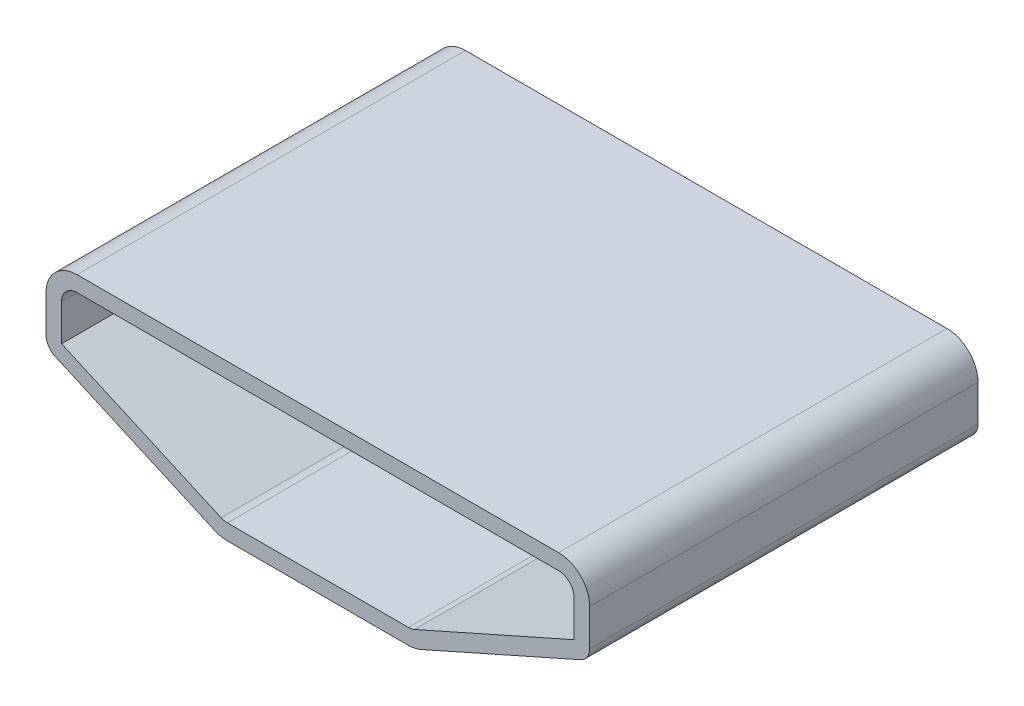
ISO-10303-21;
HEADER;
FILE_DESCRIPTION(('STEP AP214'),'2;1');
FILE_NAME('part.step','',(''),(''),'','','');
FILE_SCHEMA(('AUTOMOTIVE_DESIGN { 1 0 10303 214 1 1 1 1 }'));
ENDSEC;
DATA;
#1=APPLICATION_CONTEXT('core data for automotive mechanical design processes');
#2=APPLICATION_PROTOCOL_DEFINITION('international standard','automotive_design',2000,#1);
#3=PRODUCT_CONTEXT('',#1,'mechanical');
#4=PRODUCT('Part','Part','',(#3));
#5=PRODUCT_RELATED_PRODUCT_CATEGORY('part','',(#4));
#6=PRODUCT_DEFINITION_FORMATION('','',#4);
#7=PRODUCT_DEFINITION_CONTEXT('part definition',#1,'design');
#8=PRODUCT_DEFINITION('design','',#6,#7);
#9=PRODUCT_DEFINITION_SHAPE('','',#8);
#10=(LENGTH_UNIT() NAMED_UNIT(*) SI_UNIT(.MILLI.,.METRE.));
#11=(NAMED_UNIT(*) PLANE_ANGLE_UNIT() SI_UNIT($,.RADIAN.));
#12=(NAMED_UNIT(*) SI_UNIT($,.STERADIAN.) SOLID_ANGLE_UNIT());
#13=UNCERTAINTY_MEASURE_WITH_UNIT(LENGTH_MEASURE(1.E-05),#10,'distance_accuracy_value','');
#14=(GEOMETRIC_REPRESENTATION_CONTEXT(3) GLOBAL_UNCERTAINTY_ASSIGNED_CONTEXT((#13)) GLOBAL_UNIT_ASSIGNED_CONTEXT((#10,
#11,#12)) REPRESENTATION_CONTEXT('',''));
#15=CARTESIAN_POINT('',(0.,0.,0.));
#16=DIRECTION('',(0.,0.,1.));
#17=DIRECTION('',(1.,0.,0.));
#18=AXIS2_PLACEMENT_3D('',#15,#16,#17);
#19=CARTESIAN_POINT('',(1.07490488899147,0.0214013968547076,5.));
#20=DIRECTION('',(0.,0.,1.));
#21=DIRECTION('',(1.,0.,0.));
#22=AXIS2_PLACEMENT_3D('',#19,#20,#21);
#23=PLANE('',#22);
#24=CARTESIAN_POINT('',(1.07490488899147,0.0214013968547076,5.));
#25=DIRECTION('',(0.,0.,1.));
#26=DIRECTION('',(1.,0.,0.));
#27=AXIS2_PLACEMENT_3D('',#24,#25,#26);
#28=CIRCLE('',#27,0.4);
#29=CARTESIAN_POINT('',(1.47490488899147,0.0214013968547047,5.));
#30=VERTEX_POINT('',#29);
#31=CARTESIAN_POINT('',(1.07490488899146,0.421401396854708,5.));
#32=VERTEX_POINT('',#31);
#33=EDGE_CURVE('E273',#30,#32,#28,.T.);
#34=ORIENTED_EDGE('',*,*,#33,.T.);
#35=DIRECTION('',(-1.,0.,0.));
#36=VECTOR('',#35,1.);
#37=CARTESIAN_POINT('',(-5.12509511100853,0.421401396854708,5.));
#38=LINE('',#37,#36);
#39=CARTESIAN_POINT('',(-5.12509511100853,0.421401396854708,5.));
#40=VERTEX_POINT('',#39);
#41=EDGE_CURVE('E276',#32,#40,#38,.T.);
#42=ORIENTED_EDGE('',*,*,#41,.T.);
#43=CARTESIAN_POINT('',(-5.12509511100853,0.0214013968547076,5.));
#44=DIRECTION('',(0.,0.,1.));
#45=DIRECTION('',(-1.,0.,0.));
#46=AXIS2_PLACEMENT_3D('',#43,#44,#45);
#47=CIRCLE('',#46,0.4);
#48=CARTESIAN_POINT('',(-5.52509511100853,0.0214013968547047,5.));
#49=VERTEX_POINT('',#48);
#50=EDGE_CURVE('E279',#40,#49,#47,.T.);
#51=ORIENTED_EDGE('',*,*,#50,.T.);
#52=DIRECTION('',(0.,-1.,0.));
#53=VECTOR('',#52,1.);
#54=CARTESIAN_POINT('',(-5.52509511100853,-0.4486239853276,5.));
#55=LINE('',#54,#53);
#56=CARTESIAN_POINT('',(-5.52509511100853,-0.4486239853276,5.));
#57=VERTEX_POINT('',#56);
#58=EDGE_CURVE('E281',#49,#57,#55,.T.);
#59=ORIENTED_EDGE('',*,*,#58,.T.);
#60=CARTESIAN_POINT('',(-5.32509511100853,-0.448623985327601,5.));
#61=DIRECTION('',(0.,0.,1.));
#62=DIRECTION('',(1.,0.,0.));
#63=AXIS2_PLACEMENT_3D('',#60,#61,#62);
#64=CIRCLE('',#63,0.2);
#65=CARTESIAN_POINT('',(-5.40632280421922,-0.631386295051653,5.));
#66=VERTEX_POINT('',#65);
#67=EDGE_CURVE('E283',#57,#66,#64,.T.);
#68=ORIENTED_EDGE('',*,*,#67,.T.);
#69=DIRECTION('',(0.913811548620257,-0.406138466053448,0.));
#70=VECTOR('',#69,1.);
#71=CARTESIAN_POINT('',(-3.3526647172503,-1.54412322259339,5.));
#72=LINE('',#71,#70);
#73=CARTESIAN_POINT('',(-3.3526647172503,-1.54412322259339,5.));
#74=VERTEX_POINT('',#73);
#75=EDGE_CURVE('E285',#66,#74,#72,.T.);
#76=ORIENTED_EDGE('',*,*,#75,.T.);
#77=CARTESIAN_POINT('',(-3.19020933082892,-1.17859860314529,5.));
#78=DIRECTION('',(0.,0.,1.));
#79=DIRECTION('',(-1.,0.,0.));
#80=AXIS2_PLACEMENT_3D('',#77,#78,#79);
#81=CIRCLE('',#80,0.4);
#82=CARTESIAN_POINT('',(-3.19020933082892,-1.57859860314529,5.));
#83=VERTEX_POINT('',#82);
#84=EDGE_CURVE('E287',#74,#83,#81,.T.);
#85=ORIENTED_EDGE('',*,*,#84,.T.);
#86=DIRECTION('',(1.,0.,0.));
#87=VECTOR('',#86,1.);
#88=CARTESIAN_POINT('',(-3.19020933082892,-1.57859860314529,5.));
#89=LINE('',#88,#87);
#90=CARTESIAN_POINT('',(-0.859980891188146,-1.57859860314529,5.));
#91=VERTEX_POINT('',#90);
#92=EDGE_CURVE('E289',#83,#91,#89,.T.);
#93=ORIENTED_EDGE('',*,*,#92,.T.);
#94=CARTESIAN_POINT('',(-0.859980891188145,-1.17859860314529,5.));
#95=DIRECTION('',(0.,0.,1.));
#96=DIRECTION('',(1.,0.,0.));
#97=AXIS2_PLACEMENT_3D('',#94,#95,#96);
#98=CIRCLE('',#97,0.4);
#99=CARTESIAN_POINT('',(-0.697525504766764,-1.54412322259339,5.));
#100=VERTEX_POINT('',#99);
#101=EDGE_CURVE('E291',#91,#100,#98,.T.);
#102=ORIENTED_EDGE('',*,*,#101,.T.);
#103=DIRECTION('',(0.913811548620257,0.406138466053448,0.));
#104=VECTOR('',#103,1.);
#105=CARTESIAN_POINT('',(-0.697525504766764,-1.54412322259339,5.));
#106=LINE('',#105,#104);
#107=CARTESIAN_POINT('',(1.35613258220215,-0.631386295051653,5.));
#108=VERTEX_POINT('',#107);
#109=EDGE_CURVE('E293',#100,#108,#106,.T.);
#110=ORIENTED_EDGE('',*,*,#109,.T.);
#111=CARTESIAN_POINT('',(1.27490488899147,-0.448623985327601,5.));
#112=DIRECTION('',(0.,0.,1.));
#113=DIRECTION('',(-1.,0.,0.));
#114=AXIS2_PLACEMENT_3D('',#111,#112,#113);
#115=CIRCLE('',#114,0.2);
#116=CARTESIAN_POINT('',(1.47490488899147,-0.4486239853276,5.));
#117=VERTEX_POINT('',#116);
#118=EDGE_CURVE('E295',#108,#117,#115,.T.);
#119=ORIENTED_EDGE('',*,*,#118,.T.);
#120=DIRECTION('',(0.,1.,0.));
#121=VECTOR('',#120,1.);
#122=CARTESIAN_POINT('',(1.47490488899147,-0.4486239853276,5.));
#123=LINE('',#122,#121);
#124=EDGE_CURVE('E297',#117,#30,#123,.T.);
#125=ORIENTED_EDGE('',*,*,#124,.T.);
#126=EDGE_LOOP('',(#34,#42,#51,#59,#68,#76,#85,#93,#102,#110,#119,#125));
#127=FACE_BOUND('',#126,.T.);
#128=DIRECTION('',(0.913811548620257,0.406138466053448,0.));
#129=VECTOR('',#128,1.);
#130=CARTESIAN_POINT('',(-0.778753197977454,-1.36136091286934,5.));
#131=LINE('',#130,#129);
#132=CARTESIAN_POINT('',(-0.778753197977454,-1.36136091286934,5.));
#133=VERTEX_POINT('',#132);
#134=CARTESIAN_POINT('',(1.27490488899146,-0.448623985327601,5.));
#135=VERTEX_POINT('',#134);
#136=EDGE_CURVE('E233',#133,#135,#131,.T.);
#137=ORIENTED_EDGE('',*,*,#136,.F.);
#138=CARTESIAN_POINT('',(-0.859980891188145,-1.17859860314529,5.));
#139=DIRECTION('',(0.,0.,1.));
#140=DIRECTION('',(1.,0.,0.));
#141=AXIS2_PLACEMENT_3D('',#138,#139,#140);
#142=CIRCLE('',#141,0.2);
#143=CARTESIAN_POINT('',(-0.859980891188145,-1.37859860314529,5.));
#144=VERTEX_POINT('',#143);
#145=EDGE_CURVE('E231',#144,#133,#142,.T.);
#146=ORIENTED_EDGE('',*,*,#145,.F.);
#147=DIRECTION('',(1.,0.,0.));
#148=VECTOR('',#147,1.);
#149=CARTESIAN_POINT('',(-3.19020933082892,-1.37859860314529,5.));
#150=LINE('',#149,#148);
#151=CARTESIAN_POINT('',(-3.19020933082892,-1.37859860314529,5.));
#152=VERTEX_POINT('',#151);
#153=EDGE_CURVE('E197',#152,#144,#150,.T.);
#154=ORIENTED_EDGE('',*,*,#153,.F.);
#155=CARTESIAN_POINT('',(-3.19020933082892,-1.17859860314529,5.));
#156=DIRECTION('',(0.,0.,1.));
#157=DIRECTION('',(-1.,0.,0.));
#158=AXIS2_PLACEMENT_3D('',#155,#156,#157);
#159=CIRCLE('',#158,0.2);
#160=CARTESIAN_POINT('',(-3.27143702403961,-1.36136091286934,5.));
#161=VERTEX_POINT('',#160);
#162=EDGE_CURVE('E247',#161,#152,#159,.T.);
#163=ORIENTED_EDGE('',*,*,#162,.F.);
#164=DIRECTION('',(0.913811548620257,-0.406138466053448,0.));
#165=VECTOR('',#164,1.);
#166=CARTESIAN_POINT('',(-3.27143702403961,-1.36136091286934,5.));
#167=LINE('',#166,#165);
#168=CARTESIAN_POINT('',(-5.32509511100853,-0.4486239853276,5.));
#169=VERTEX_POINT('',#168);
#170=EDGE_CURVE('E245',#169,#161,#167,.T.);
#171=ORIENTED_EDGE('',*,*,#170,.F.);
#172=DIRECTION('',(0.,-1.,0.));
#173=VECTOR('',#172,1.);
#174=CARTESIAN_POINT('',(-5.32509511100853,-0.4486239853276,5.));
#175=LINE('',#174,#173);
#176=CARTESIAN_POINT('',(-5.32509511100853,0.0214013968547062,5.));
#177=VERTEX_POINT('',#176);
#178=EDGE_CURVE('E243',#177,#169,#175,.T.);
#179=ORIENTED_EDGE('',*,*,#178,.F.);
#180=CARTESIAN_POINT('',(-5.12509511100853,0.0214013968547076,5.));
#181=DIRECTION('',(0.,0.,1.));
#182=DIRECTION('',(-1.,0.,0.));
#183=AXIS2_PLACEMENT_3D('',#180,#181,#182);
#184=CIRCLE('',#183,0.2);
#185=CARTESIAN_POINT('',(-5.12509511100853,0.221401396854707,5.));
#186=VERTEX_POINT('',#185);
#187=EDGE_CURVE('E241',#186,#177,#184,.T.);
#188=ORIENTED_EDGE('',*,*,#187,.F.);
#189=DIRECTION('',(-1.,0.,0.));
#190=VECTOR('',#189,1.);
#191=CARTESIAN_POINT('',(-5.12509511100853,0.221401396854708,5.));
#192=LINE('',#191,#190);
#193=CARTESIAN_POINT('',(1.07490488899146,0.221401396854708,5.));
#194=VERTEX_POINT('',#193);
#195=EDGE_CURVE('E239',#194,#186,#192,.T.);
#196=ORIENTED_EDGE('',*,*,#195,.F.);
#197=CARTESIAN_POINT('',(1.07490488899147,0.0214013968547076,5.));
#198=DIRECTION('',(0.,0.,1.));
#199=DIRECTION('',(1.,0.,0.));
#200=AXIS2_PLACEMENT_3D('',#197,#198,#199);
#201=CIRCLE('',#200,0.2);
#202=CARTESIAN_POINT('',(1.27490488899147,0.0214013968547048,5.));
#203=VERTEX_POINT('',#202);
#204=EDGE_CURVE('E237',#203,#194,#201,.T.);
#205=ORIENTED_EDGE('',*,*,#204,.F.);
#206=DIRECTION('',(0.,1.,0.));
#207=VECTOR('',#206,1.);
#208=CARTESIAN_POINT('',(1.27490488899146,-0.448623985327601,5.));
#209=LINE('',#208,#207);
#210=EDGE_CURVE('E235',#135,#203,#209,.T.);
#211=ORIENTED_EDGE('',*,*,#210,.F.);
#212=EDGE_LOOP('',(#137,#146,#154,#163,#171,#179,#188,#196,#205,#211));
#213=FACE_BOUND('',#212,.T.);
#214=ADVANCED_FACE('F39',(#127,#213),#23,.T.);
#215=CARTESIAN_POINT('',(1.07490488899147,0.0214013968547076,0.));
#216=DIRECTION('',(0.,0.,1.));
#217=DIRECTION('',(1.,0.,0.));
#218=AXIS2_PLACEMENT_3D('',#215,#216,#217);
#219=PLANE('',#218);
#220=DIRECTION('',(0.,-1.,0.));
#221=VECTOR('',#220,1.);
#222=CARTESIAN_POINT('',(-5.52509511100853,-0.4486239853276,0.));
#223=LINE('',#222,#221);
#224=CARTESIAN_POINT('',(-5.52509511100853,0.0214013968547047,0.));
#225=VERTEX_POINT('',#224);
#226=CARTESIAN_POINT('',(-5.52509511100853,-0.4486239853276,0.));
#227=VERTEX_POINT('',#226);
#228=EDGE_CURVE('E306',#225,#227,#223,.T.);
#229=ORIENTED_EDGE('',*,*,#228,.F.);
#230=CARTESIAN_POINT('',(-5.12509511100853,0.0214013968547076,0.));
#231=DIRECTION('',(0.,0.,1.));
#232=DIRECTION('',(-1.,0.,0.));
#233=AXIS2_PLACEMENT_3D('',#230,#231,#232);
#234=CIRCLE('',#233,0.4);
#235=CARTESIAN_POINT('',(-5.12509511100853,0.421401396854708,0.));
#236=VERTEX_POINT('',#235);
#237=EDGE_CURVE('E304',#236,#225,#234,.T.);
#238=ORIENTED_EDGE('',*,*,#237,.F.);
#239=DIRECTION('',(-1.,0.,0.));
#240=VECTOR('',#239,1.);
#241=CARTESIAN_POINT('',(-5.12509511100853,0.421401396854708,0.));
#242=LINE('',#241,#240);
#243=CARTESIAN_POINT('',(1.07490488899146,0.421401396854708,0.));
#244=VERTEX_POINT('',#243);
#245=EDGE_CURVE('E302',#244,#236,#242,.T.);
#246=ORIENTED_EDGE('',*,*,#245,.F.);
#247=CARTESIAN_POINT('',(1.07490488899147,0.0214013968547076,0.));
#248=DIRECTION('',(0.,0.,1.));
#249=DIRECTION('',(1.,0.,0.));
#250=AXIS2_PLACEMENT_3D('',#247,#248,#249);
#251=CIRCLE('',#250,0.4);
#252=CARTESIAN_POINT('',(1.47490488899147,0.0214013968547047,0.));
#253=VERTEX_POINT('',#252);
#254=EDGE_CURVE('E272',#253,#244,#251,.T.);
#255=ORIENTED_EDGE('',*,*,#254,.F.);
#256=DIRECTION('',(0.,1.,0.));
#257=VECTOR('',#256,1.);
#258=CARTESIAN_POINT('',(1.47490488899147,-0.4486239853276,0.));
#259=LINE('',#258,#257);
#260=CARTESIAN_POINT('',(1.47490488899147,-0.4486239853276,0.));
#261=VERTEX_POINT('',#260);
#262=EDGE_CURVE('E277',#261,#253,#259,.T.);
#263=ORIENTED_EDGE('',*,*,#262,.F.);
#264=CARTESIAN_POINT('',(1.27490488899147,-0.448623985327601,0.));
#265=DIRECTION('',(0.,0.,1.));
#266=DIRECTION('',(-1.,0.,0.));
#267=AXIS2_PLACEMENT_3D('',#264,#265,#266);
#268=CIRCLE('',#267,0.2);
#269=CARTESIAN_POINT('',(1.35613258220215,-0.631386295051653,0.));
#270=VERTEX_POINT('',#269);
#271=EDGE_CURVE('E320',#270,#261,#268,.T.);
#272=ORIENTED_EDGE('',*,*,#271,.F.);
#273=DIRECTION('',(0.913811548620257,0.406138466053448,0.));
#274=VECTOR('',#273,1.);
#275=CARTESIAN_POINT('',(-0.697525504766764,-1.54412322259339,0.));
#276=LINE('',#275,#274);
#277=CARTESIAN_POINT('',(-0.697525504766764,-1.54412322259339,0.));
#278=VERTEX_POINT('',#277);
#279=EDGE_CURVE('E318',#278,#270,#276,.T.);
#280=ORIENTED_EDGE('',*,*,#279,.F.);
#281=CARTESIAN_POINT('',(-0.859980891188145,-1.17859860314529,0.));
#282=DIRECTION('',(0.,0.,1.));
#283=DIRECTION('',(1.,0.,0.));
#284=AXIS2_PLACEMENT_3D('',#281,#282,#283);
#285=CIRCLE('',#284,0.4);
#286=CARTESIAN_POINT('',(-0.859980891188146,-1.57859860314529,0.));
#287=VERTEX_POINT('',#286);
#288=EDGE_CURVE('E316',#287,#278,#285,.T.);
#289=ORIENTED_EDGE('',*,*,#288,.F.);
#290=DIRECTION('',(1.,0.,0.));
#291=VECTOR('',#290,1.);
#292=CARTESIAN_POINT('',(-3.19020933082892,-1.57859860314529,0.));
#293=LINE('',#292,#291);
#294=CARTESIAN_POINT('',(-3.19020933082892,-1.57859860314529,0.));
#295=VERTEX_POINT('',#294);
#296=EDGE_CURVE('E314',#295,#287,#293,.T.);
#297=ORIENTED_EDGE('',*,*,#296,.F.);
#298=CARTESIAN_POINT('',(-3.19020933082892,-1.17859860314529,0.));
#299=DIRECTION('',(0.,0.,1.));
#300=DIRECTION('',(-1.,0.,0.));
#301=AXIS2_PLACEMENT_3D('',#298,#299,#300);
#302=CIRCLE('',#301,0.4);
#303=CARTESIAN_POINT('',(-3.3526647172503,-1.54412322259339,0.));
#304=VERTEX_POINT('',#303);
#305=EDGE_CURVE('E312',#304,#295,#302,.T.);
#306=ORIENTED_EDGE('',*,*,#305,.F.);
#307=DIRECTION('',(0.913811548620257,-0.406138466053448,0.));
#308=VECTOR('',#307,1.);
#309=CARTESIAN_POINT('',(-3.3526647172503,-1.54412322259339,0.));
#310=LINE('',#309,#308);
#311=CARTESIAN_POINT('',(-5.40632280421922,-0.631386295051653,0.));
#312=VERTEX_POINT('',#311);
#313=EDGE_CURVE('E310',#312,#304,#310,.T.);
#314=ORIENTED_EDGE('',*,*,#313,.F.);
#315=CARTESIAN_POINT('',(-5.32509511100853,-0.448623985327601,0.));
#316=DIRECTION('',(0.,0.,1.));
#317=DIRECTION('',(1.,0.,0.));
#318=AXIS2_PLACEMENT_3D('',#315,#316,#317);
#319=CIRCLE('',#318,0.2);
#320=EDGE_CURVE('E308',#227,#312,#319,.T.);
#321=ORIENTED_EDGE('',*,*,#320,.F.);
#322=EDGE_LOOP('',(#229,#238,#246,#255,#263,#272,#280,#289,#297,#306,#314,#321));
#323=FACE_BOUND('',#322,.T.);
#324=ADVANCED_FACE('F361',(#323),#219,.F.);
#325=CARTESIAN_POINT('',(1.07490488899147,0.0214013968547076,5.));
#326=DIRECTION('',(0.,0.,-1.));
#327=DIRECTION('',(-1.,0.,0.));
#328=AXIS2_PLACEMENT_3D('',#325,#326,#327);
#329=CYLINDRICAL_SURFACE('',#328,0.4);
#330=ORIENTED_EDGE('',*,*,#254,.T.);
#331=DIRECTION('',(0.,0.,-1.));
#332=VECTOR('',#331,1.);
#333=CARTESIAN_POINT('',(1.07490488899146,0.421401396854708,5.));
#334=LINE('',#333,#332);
#335=EDGE_CURVE('E11',#32,#244,#334,.T.);
#336=ORIENTED_EDGE('',*,*,#335,.F.);
#337=ORIENTED_EDGE('',*,*,#33,.F.);
#338=DIRECTION('',(0.,0.,-1.));
#339=VECTOR('',#338,1.);
#340=CARTESIAN_POINT('',(1.47490488899147,0.0214013968547047,5.));
#341=LINE('',#340,#339);
#342=EDGE_CURVE('E299',#30,#253,#341,.T.);
#343=ORIENTED_EDGE('',*,*,#342,.T.);
#344=EDGE_LOOP('',(#330,#336,#337,#343));
#345=FACE_BOUND('',#344,.T.);
#346=ADVANCED_FACE('F41',(#345),#329,.T.);
#347=CARTESIAN_POINT('',(-5.12509511100853,0.421401396854708,5.));
#348=DIRECTION('',(0.,-1.,0.));
#349=DIRECTION('',(0.,0.,-1.));
#350=AXIS2_PLACEMENT_3D('',#347,#348,#349);
#351=PLANE('',#350);
#352=ORIENTED_EDGE('',*,*,#245,.T.);
#353=DIRECTION('',(0.,0.,-1.));
#354=VECTOR('',#353,1.);
#355=CARTESIAN_POINT('',(-5.12509511100853,0.421401396854708,5.));
#356=LINE('',#355,#354);
#357=EDGE_CURVE('E47',#40,#236,#356,.T.);
#358=ORIENTED_EDGE('',*,*,#357,.F.);
#359=ORIENTED_EDGE('',*,*,#41,.F.);
#360=ORIENTED_EDGE('',*,*,#335,.T.);
#361=EDGE_LOOP('',(#352,#358,#359,#360));
#362=FACE_BOUND('',#361,.T.);
#363=ADVANCED_FACE('F379',(#362),#351,.F.);
#364=CARTESIAN_POINT('',(-5.12509511100853,0.0214013968547076,5.));
#365=DIRECTION('',(0.,0.,-1.));
#366=DIRECTION('',(-1.,0.,0.));
#367=AXIS2_PLACEMENT_3D('',#364,#365,#366);
#368=CYLINDRICAL_SURFACE('',#367,0.4);
#369=ORIENTED_EDGE('',*,*,#237,.T.);
#370=DIRECTION('',(0.,0.,-1.));
#371=VECTOR('',#370,1.);
#372=CARTESIAN_POINT('',(-5.52509511100853,0.0214013968547047,5.));
#373=LINE('',#372,#371);
#374=EDGE_CURVE('E349',#49,#225,#373,.T.);
#375=ORIENTED_EDGE('',*,*,#374,.F.);
#376=ORIENTED_EDGE('',*,*,#50,.F.);
#377=ORIENTED_EDGE('',*,*,#357,.T.);
#378=EDGE_LOOP('',(#369,#375,#376,#377));
#379=FACE_BOUND('',#378,.T.);
#380=ADVANCED_FACE('F356',(#379),#368,.T.);
#381=CARTESIAN_POINT('',(-5.52509511100853,-0.4486239853276,5.));
#382=DIRECTION('',(1.,0.,0.));
#383=DIRECTION('',(0.,0.,-1.));
#384=AXIS2_PLACEMENT_3D('',#381,#382,#383);
#385=PLANE('',#384);
#386=ORIENTED_EDGE('',*,*,#228,.T.);
#387=DIRECTION('',(0.,0.,-1.));
#388=VECTOR('',#387,1.);
#389=CARTESIAN_POINT('',(-5.52509511100853,-0.4486239853276,5.));
#390=LINE('',#389,#388);
#391=EDGE_CURVE('E346',#57,#227,#390,.T.);
#392=ORIENTED_EDGE('',*,*,#391,.F.);
#393=ORIENTED_EDGE('',*,*,#58,.F.);
#394=ORIENTED_EDGE('',*,*,#374,.T.);
#395=EDGE_LOOP('',(#386,#392,#393,#394));
#396=FACE_BOUND('',#395,.T.);
#397=ADVANCED_FACE('F367',(#396),#385,.F.);
#398=CARTESIAN_POINT('',(-5.32509511100853,-0.448623985327601,5.));
#399=DIRECTION('',(0.,0.,-1.));
#400=DIRECTION('',(-1.,0.,0.));
#401=AXIS2_PLACEMENT_3D('',#398,#399,#400);
#402=CYLINDRICAL_SURFACE('',#401,0.2);
#403=ORIENTED_EDGE('',*,*,#320,.T.);
#404=DIRECTION('',(0.,0.,-1.));
#405=VECTOR('',#404,1.);
#406=CARTESIAN_POINT('',(-5.40632280421922,-0.631386295051653,5.));
#407=LINE('',#406,#405);
#408=EDGE_CURVE('E343',#66,#312,#407,.T.);
#409=ORIENTED_EDGE('',*,*,#408,.F.);
#410=ORIENTED_EDGE('',*,*,#67,.F.);
#411=ORIENTED_EDGE('',*,*,#391,.T.);
#412=EDGE_LOOP('',(#403,#409,#410,#411));
#413=FACE_BOUND('',#412,.T.);
#414=ADVANCED_FACE('F371',(#413),#402,.T.);
#415=CARTESIAN_POINT('',(-3.3526647172503,-1.54412322259339,5.));
#416=DIRECTION('',(0.406138466053448,0.913811548620257,0.));
#417=DIRECTION('',(-0.913811548620257,0.406138466053448,0.));
#418=AXIS2_PLACEMENT_3D('',#415,#416,#417);
#419=PLANE('',#418);
#420=ORIENTED_EDGE('',*,*,#313,.T.);
#421=DIRECTION('',(0.,0.,-1.));
#422=VECTOR('',#421,1.);
#423=CARTESIAN_POINT('',(-3.3526647172503,-1.54412322259339,5.));
#424=LINE('',#423,#422);
#425=EDGE_CURVE('E340',#74,#304,#424,.T.);
#426=ORIENTED_EDGE('',*,*,#425,.F.);
#427=ORIENTED_EDGE('',*,*,#75,.F.);
#428=ORIENTED_EDGE('',*,*,#408,.T.);
#429=EDGE_LOOP('',(#420,#426,#427,#428));
#430=FACE_BOUND('',#429,.T.);
#431=ADVANCED_FACE('F412',(#430),#419,.F.);
#432=CARTESIAN_POINT('',(-3.19020933082892,-1.17859860314529,5.));
#433=DIRECTION('',(0.,0.,-1.));
#434=DIRECTION('',(-1.,0.,0.));
#435=AXIS2_PLACEMENT_3D('',#432,#433,#434);
#436=CYLINDRICAL_SURFACE('',#435,0.4);
#437=ORIENTED_EDGE('',*,*,#305,.T.);
#438=DIRECTION('',(0.,0.,-1.));
#439=VECTOR('',#438,1.);
#440=CARTESIAN_POINT('',(-3.19020933082892,-1.57859860314529,5.));
#441=LINE('',#440,#439);
#442=EDGE_CURVE('E337',#83,#295,#441,.T.);
#443=ORIENTED_EDGE('',*,*,#442,.F.);
#444=ORIENTED_EDGE('',*,*,#84,.F.);
#445=ORIENTED_EDGE('',*,*,#425,.T.);
#446=EDGE_LOOP('',(#437,#443,#444,#445));
#447=FACE_BOUND('',#446,.T.);
#448=ADVANCED_FACE('F410',(#447),#436,.T.);
#449=CARTESIAN_POINT('',(-3.19020933082892,-1.57859860314529,5.));
#450=DIRECTION('',(0.,1.,0.));
#451=DIRECTION('',(0.,0.,1.));
#452=AXIS2_PLACEMENT_3D('',#449,#450,#451);
#453=PLANE('',#452);
#454=ORIENTED_EDGE('',*,*,#296,.T.);
#455=DIRECTION('',(0.,0.,-1.));
#456=VECTOR('',#455,1.);
#457=CARTESIAN_POINT('',(-0.859980891188146,-1.57859860314529,5.));
#458=LINE('',#457,#456);
#459=EDGE_CURVE('E334',#91,#287,#458,.T.);
#460=ORIENTED_EDGE('',*,*,#459,.F.);
#461=ORIENTED_EDGE('',*,*,#92,.F.);
#462=ORIENTED_EDGE('',*,*,#442,.T.);
#463=EDGE_LOOP('',(#454,#460,#461,#462));
#464=FACE_BOUND('',#463,.T.);
#465=ADVANCED_FACE('F406',(#464),#453,.F.);
#466=CARTESIAN_POINT('',(-0.859980891188145,-1.17859860314529,5.));
#467=DIRECTION('',(0.,0.,-1.));
#468=DIRECTION('',(-1.,0.,0.));
#469=AXIS2_PLACEMENT_3D('',#466,#467,#468);
#470=CYLINDRICAL_SURFACE('',#469,0.4);
#471=ORIENTED_EDGE('',*,*,#288,.T.);
#472=DIRECTION('',(0.,0.,-1.));
#473=VECTOR('',#472,1.);
#474=CARTESIAN_POINT('',(-0.697525504766764,-1.54412322259339,5.));
#475=LINE('',#474,#473);
#476=EDGE_CURVE('E331',#100,#278,#475,.T.);
#477=ORIENTED_EDGE('',*,*,#476,.F.);
#478=ORIENTED_EDGE('',*,*,#101,.F.);
#479=ORIENTED_EDGE('',*,*,#459,.T.);
#480=EDGE_LOOP('',(#471,#477,#478,#479));
#481=FACE_BOUND('',#480,.T.);
#482=ADVANCED_FACE('F401',(#481),#470,.T.);
#483=CARTESIAN_POINT('',(-0.697525504766764,-1.54412322259339,5.));
#484=DIRECTION('',(-0.406138466053448,0.913811548620257,0.));
#485=DIRECTION('',(-0.913811548620257,-0.406138466053448,0.));
#486=AXIS2_PLACEMENT_3D('',#483,#484,#485);
#487=PLANE('',#486);
#488=ORIENTED_EDGE('',*,*,#279,.T.);
#489=DIRECTION('',(0.,0.,-1.));
#490=VECTOR('',#489,1.);
#491=CARTESIAN_POINT('',(1.35613258220215,-0.631386295051653,5.));
#492=LINE('',#491,#490);
#493=EDGE_CURVE('E328',#108,#270,#492,.T.);
#494=ORIENTED_EDGE('',*,*,#493,.F.);
#495=ORIENTED_EDGE('',*,*,#109,.F.);
#496=ORIENTED_EDGE('',*,*,#476,.T.);
#497=EDGE_LOOP('',(#488,#494,#495,#496));
#498=FACE_BOUND('',#497,.T.);
#499=ADVANCED_FACE('F395',(#498),#487,.F.);
#500=CARTESIAN_POINT('',(1.27490488899147,-0.448623985327601,5.));
#501=DIRECTION('',(0.,0.,-1.));
#502=DIRECTION('',(-1.,0.,0.));
#503=AXIS2_PLACEMENT_3D('',#500,#501,#502);
#504=CYLINDRICAL_SURFACE('',#503,0.2);
#505=ORIENTED_EDGE('',*,*,#271,.T.);
#506=DIRECTION('',(0.,0.,-1.));
#507=VECTOR('',#506,1.);
#508=CARTESIAN_POINT('',(1.47490488899147,-0.4486239853276,5.));
#509=LINE('',#508,#507);
#510=EDGE_CURVE('E325',#117,#261,#509,.T.);
#511=ORIENTED_EDGE('',*,*,#510,.F.);
#512=ORIENTED_EDGE('',*,*,#118,.F.);
#513=ORIENTED_EDGE('',*,*,#493,.T.);
#514=EDGE_LOOP('',(#505,#511,#512,#513));
#515=FACE_BOUND('',#514,.T.);
#516=ADVANCED_FACE('F391',(#515),#504,.T.);
#517=CARTESIAN_POINT('',(1.47490488899147,-0.4486239853276,5.));
#518=DIRECTION('',(-1.,0.,0.));
#519=DIRECTION('',(0.,0.,1.));
#520=AXIS2_PLACEMENT_3D('',#517,#518,#519);
#521=PLANE('',#520);
#522=ORIENTED_EDGE('',*,*,#262,.T.);
#523=ORIENTED_EDGE('',*,*,#342,.F.);
#524=ORIENTED_EDGE('',*,*,#124,.F.);
#525=ORIENTED_EDGE('',*,*,#510,.T.);
#526=EDGE_LOOP('',(#522,#523,#524,#525));
#527=FACE_BOUND('',#526,.T.);
#528=ADVANCED_FACE('F386',(#527),#521,.F.);
#529=CARTESIAN_POINT('',(-0.859980891188145,-1.17859860314529,5.));
#530=DIRECTION('',(0.,0.,-1.));
#531=DIRECTION('',(-1.,0.,0.));
#532=AXIS2_PLACEMENT_3D('',#529,#530,#531);
#533=CYLINDRICAL_SURFACE('',#532,0.2);
#534=CARTESIAN_POINT('',(-0.859980891188145,-1.17859860314529,0.5));
#535=DIRECTION('',(0.,0.,1.));
#536=DIRECTION('',(1.,0.,0.));
#537=AXIS2_PLACEMENT_3D('',#534,#535,#536);
#538=CIRCLE('',#537,0.200000000000003);
#539=CARTESIAN_POINT('',(-0.859980891188145,-1.37859860314529,0.5));
#540=VERTEX_POINT('',#539);
#541=CARTESIAN_POINT('',(-0.778753197977454,-1.36136091286934,0.5));
#542=VERTEX_POINT('',#541);
#543=EDGE_CURVE('E203',#540,#542,#538,.T.);
#544=ORIENTED_EDGE('',*,*,#543,.F.);
#545=DIRECTION('',(0.,0.,-1.));
#546=VECTOR('',#545,1.);
#547=CARTESIAN_POINT('',(-0.859980891188145,-1.37859860314529,5.));
#548=LINE('',#547,#546);
#549=EDGE_CURVE('E190',#144,#540,#548,.T.);
#550=ORIENTED_EDGE('',*,*,#549,.F.);
#551=ORIENTED_EDGE('',*,*,#145,.T.);
#552=DIRECTION('',(0.,0.,-1.));
#553=VECTOR('',#552,1.);
#554=CARTESIAN_POINT('',(-0.778753197977454,-1.36136091286934,5.));
#555=LINE('',#554,#553);
#556=EDGE_CURVE('E205',#133,#542,#555,.T.);
#557=ORIENTED_EDGE('',*,*,#556,.T.);
#558=EDGE_LOOP('',(#544,#550,#551,#557));
#559=FACE_BOUND('',#558,.T.);
#560=ADVANCED_FACE('F204',(#559),#533,.F.);
#561=CARTESIAN_POINT('',(-0.778753197977454,-1.36136091286934,5.));
#562=DIRECTION('',(-0.406138466053448,0.913811548620257,0.));
#563=DIRECTION('',(-0.913811548620257,-0.406138466053448,0.));
#564=AXIS2_PLACEMENT_3D('',#561,#562,#563);
#565=PLANE('',#564);
#566=DIRECTION('',(0.913811548620257,0.406138466053448,0.));
#567=VECTOR('',#566,1.);
#568=CARTESIAN_POINT('',(1.27490488899147,-0.448623985327601,0.5));
#569=LINE('',#568,#567);
#570=CARTESIAN_POINT('',(1.27490488899146,-0.448623985327601,0.5));
#571=VERTEX_POINT('',#570);
#572=EDGE_CURVE('E54',#542,#571,#569,.T.);
#573=ORIENTED_EDGE('',*,*,#572,.F.);
#574=ORIENTED_EDGE('',*,*,#556,.F.);
#575=ORIENTED_EDGE('',*,*,#136,.T.);
#576=DIRECTION('',(0.,0.,-1.));
#577=VECTOR('',#576,1.);
#578=CARTESIAN_POINT('',(1.27490488899146,-0.448623985327601,5.));
#579=LINE('',#578,#577);
#580=EDGE_CURVE('E269',#135,#571,#579,.T.);
#581=ORIENTED_EDGE('',*,*,#580,.T.);
#582=EDGE_LOOP('',(#573,#574,#575,#581));
#583=FACE_BOUND('',#582,.T.);
#584=ADVANCED_FACE('F487',(#583),#565,.T.);
#585=CARTESIAN_POINT('',(1.27490488899146,-0.448623985327601,5.));
#586=DIRECTION('',(-1.,0.,0.));
#587=DIRECTION('',(0.,-1.,0.));
#588=AXIS2_PLACEMENT_3D('',#585,#586,#587);
#589=PLANE('',#588);
#590=DIRECTION('',(0.,1.,0.));
#591=VECTOR('',#590,1.);
#592=CARTESIAN_POINT('',(1.27490488899147,0.304244109329327,0.5));
#593=LINE('',#592,#591);
#594=CARTESIAN_POINT('',(1.27490488899147,0.0214013968547048,0.5));
#595=VERTEX_POINT('',#594);
#596=EDGE_CURVE('E62',#571,#595,#593,.T.);
#597=ORIENTED_EDGE('',*,*,#596,.F.);
#598=ORIENTED_EDGE('',*,*,#580,.F.);
#599=ORIENTED_EDGE('',*,*,#210,.T.);
#600=DIRECTION('',(0.,0.,-1.));
#601=VECTOR('',#600,1.);
#602=CARTESIAN_POINT('',(1.27490488899147,0.0214013968547048,5.));
#603=LINE('',#602,#601);
#604=EDGE_CURVE('E267',#203,#595,#603,.T.);
#605=ORIENTED_EDGE('',*,*,#604,.T.);
#606=EDGE_LOOP('',(#597,#598,#599,#605));
#607=FACE_BOUND('',#606,.T.);
#608=ADVANCED_FACE('F494',(#607),#589,.T.);
#609=CARTESIAN_POINT('',(1.07490488899147,0.0214013968547076,5.));
#610=DIRECTION('',(0.,0.,-1.));
#611=DIRECTION('',(-1.,0.,0.));
#612=AXIS2_PLACEMENT_3D('',#609,#610,#611);
#613=CYLINDRICAL_SURFACE('',#612,0.2);
#614=CARTESIAN_POINT('',(1.07490488899147,0.0214013968547076,0.5));
#615=DIRECTION('',(0.,0.,1.));
#616=DIRECTION('',(1.,0.,0.));
#617=AXIS2_PLACEMENT_3D('',#614,#615,#616);
#618=CIRCLE('',#617,0.2);
#619=CARTESIAN_POINT('',(1.07490488899146,0.221401396854708,0.5));
#620=VERTEX_POINT('',#619);
#621=EDGE_CURVE('E228',#595,#620,#618,.T.);
#622=ORIENTED_EDGE('',*,*,#621,.F.);
#623=ORIENTED_EDGE('',*,*,#604,.F.);
#624=ORIENTED_EDGE('',*,*,#204,.T.);
#625=DIRECTION('',(0.,0.,-1.));
#626=VECTOR('',#625,1.);
#627=CARTESIAN_POINT('',(1.07490488899146,0.221401396854708,5.));
#628=LINE('',#627,#626);
#629=EDGE_CURVE('E264',#194,#620,#628,.T.);
#630=ORIENTED_EDGE('',*,*,#629,.T.);
#631=EDGE_LOOP('',(#622,#623,#624,#630));
#632=FACE_BOUND('',#631,.T.);
#633=ADVANCED_FACE('F501',(#632),#613,.F.);
#634=CARTESIAN_POINT('',(-5.12509511100853,0.221401396854708,5.));
#635=DIRECTION('',(0.,-1.,0.));
#636=DIRECTION('',(0.,0.,-1.));
#637=AXIS2_PLACEMENT_3D('',#634,#635,#636);
#638=PLANE('',#637);
#639=DIRECTION('',(-1.,0.,0.));
#640=VECTOR('',#639,1.);
#641=CARTESIAN_POINT('',(-5.12509511100853,0.221401396854708,0.5));
#642=LINE('',#641,#640);
#643=CARTESIAN_POINT('',(-5.12509511100853,0.221401396854707,0.5));
#644=VERTEX_POINT('',#643);
#645=EDGE_CURVE('E225',#620,#644,#642,.T.);
#646=ORIENTED_EDGE('',*,*,#645,.F.);
#647=ORIENTED_EDGE('',*,*,#629,.F.);
#648=ORIENTED_EDGE('',*,*,#195,.T.);
#649=DIRECTION('',(0.,0.,-1.));
#650=VECTOR('',#649,1.);
#651=CARTESIAN_POINT('',(-5.12509511100853,0.221401396854707,5.));
#652=LINE('',#651,#650);
#653=EDGE_CURVE('E261',#186,#644,#652,.T.);
#654=ORIENTED_EDGE('',*,*,#653,.T.);
#655=EDGE_LOOP('',(#646,#647,#648,#654));
#656=FACE_BOUND('',#655,.T.);
#657=ADVANCED_FACE('F509',(#656),#638,.T.);
#658=CARTESIAN_POINT('',(-5.12509511100853,0.0214013968547076,5.));
#659=DIRECTION('',(0.,0.,-1.));
#660=DIRECTION('',(-1.,0.,0.));
#661=AXIS2_PLACEMENT_3D('',#658,#659,#660);
#662=CYLINDRICAL_SURFACE('',#661,0.2);
#663=CARTESIAN_POINT('',(-5.12509511100853,0.0214013968547076,0.5));
#664=DIRECTION('',(0.,0.,1.));
#665=DIRECTION('',(1.,0.,0.));
#666=AXIS2_PLACEMENT_3D('',#663,#664,#665);
#667=CIRCLE('',#666,0.2);
#668=CARTESIAN_POINT('',(-5.32509511100853,0.0214013968547062,0.5));
#669=VERTEX_POINT('',#668);
#670=EDGE_CURVE('E222',#644,#669,#667,.T.);
#671=ORIENTED_EDGE('',*,*,#670,.F.);
#672=ORIENTED_EDGE('',*,*,#653,.F.);
#673=ORIENTED_EDGE('',*,*,#187,.T.);
#674=DIRECTION('',(0.,0.,-1.));
#675=VECTOR('',#674,1.);
#676=CARTESIAN_POINT('',(-5.32509511100853,0.0214013968547062,5.));
#677=LINE('',#676,#675);
#678=EDGE_CURVE('E258',#177,#669,#677,.T.);
#679=ORIENTED_EDGE('',*,*,#678,.T.);
#680=EDGE_LOOP('',(#671,#672,#673,#679));
#681=FACE_BOUND('',#680,.T.);
#682=ADVANCED_FACE('F518',(#681),#662,.F.);
#683=CARTESIAN_POINT('',(-5.32509511100853,-0.4486239853276,5.));
#684=DIRECTION('',(1.,0.,0.));
#685=DIRECTION('',(0.,1.,0.));
#686=AXIS2_PLACEMENT_3D('',#683,#684,#685);
#687=PLANE('',#686);
#688=DIRECTION('',(0.,-1.,0.));
#689=VECTOR('',#688,1.);
#690=CARTESIAN_POINT('',(-5.32509511100853,-0.4486239853276,0.5));
#691=LINE('',#690,#689);
#692=CARTESIAN_POINT('',(-5.32509511100853,-0.4486239853276,0.5));
#693=VERTEX_POINT('',#692);
#694=EDGE_CURVE('E219',#669,#693,#691,.T.);
#695=ORIENTED_EDGE('',*,*,#694,.F.);
#696=ORIENTED_EDGE('',*,*,#678,.F.);
#697=ORIENTED_EDGE('',*,*,#178,.T.);
#698=DIRECTION('',(0.,0.,-1.));
#699=VECTOR('',#698,1.);
#700=CARTESIAN_POINT('',(-5.32509511100853,-0.4486239853276,5.));
#701=LINE('',#700,#699);
#702=EDGE_CURVE('E255',#169,#693,#701,.T.);
#703=ORIENTED_EDGE('',*,*,#702,.T.);
#704=EDGE_LOOP('',(#695,#696,#697,#703));
#705=FACE_BOUND('',#704,.T.);
#706=ADVANCED_FACE('F527',(#705),#687,.T.);
#707=CARTESIAN_POINT('',(-3.27143702403961,-1.36136091286934,5.));
#708=DIRECTION('',(0.406138466053448,0.913811548620257,0.));
#709=DIRECTION('',(-0.913811548620257,0.406138466053448,0.));
#710=AXIS2_PLACEMENT_3D('',#707,#708,#709);
#711=PLANE('',#710);
#712=DIRECTION('',(0.913811548620257,-0.406138466053448,0.));
#713=VECTOR('',#712,1.);
#714=CARTESIAN_POINT('',(-5.32509511100853,-0.4486239853276,0.5));
#715=LINE('',#714,#713);
#716=CARTESIAN_POINT('',(-3.27143702403961,-1.36136091286934,0.5));
#717=VERTEX_POINT('',#716);
#718=EDGE_CURVE('E213',#693,#717,#715,.T.);
#719=ORIENTED_EDGE('',*,*,#718,.F.);
#720=ORIENTED_EDGE('',*,*,#702,.F.);
#721=ORIENTED_EDGE('',*,*,#170,.T.);
#722=DIRECTION('',(0.,0.,-1.));
#723=VECTOR('',#722,1.);
#724=CARTESIAN_POINT('',(-3.27143702403961,-1.36136091286934,5.));
#725=LINE('',#724,#723);
#726=EDGE_CURVE('E252',#161,#717,#725,.T.);
#727=ORIENTED_EDGE('',*,*,#726,.T.);
#728=EDGE_LOOP('',(#719,#720,#721,#727));
#729=FACE_BOUND('',#728,.T.);
#730=ADVANCED_FACE('F536',(#729),#711,.T.);
#731=CARTESIAN_POINT('',(-3.19020933082892,-1.17859860314529,5.));
#732=DIRECTION('',(0.,0.,-1.));
#733=DIRECTION('',(-1.,0.,0.));
#734=AXIS2_PLACEMENT_3D('',#731,#732,#733);
#735=CYLINDRICAL_SURFACE('',#734,0.2);
#736=CARTESIAN_POINT('',(-3.19020933082892,-1.17859860314527,0.5));
#737=DIRECTION('',(0.,0.,1.));
#738=DIRECTION('',(1.,0.,0.));
#739=AXIS2_PLACEMENT_3D('',#736,#737,#738);
#740=CIRCLE('',#739,0.200000000000017);
#741=CARTESIAN_POINT('',(-3.19020933082892,-1.37859860314529,0.5));
#742=VERTEX_POINT('',#741);
#743=EDGE_CURVE('E211',#717,#742,#740,.T.);
#744=ORIENTED_EDGE('',*,*,#743,.F.);
#745=ORIENTED_EDGE('',*,*,#726,.F.);
#746=ORIENTED_EDGE('',*,*,#162,.T.);
#747=DIRECTION('',(0.,0.,-1.));
#748=VECTOR('',#747,1.);
#749=CARTESIAN_POINT('',(-3.19020933082892,-1.37859860314529,5.));
#750=LINE('',#749,#748);
#751=EDGE_CURVE('E200',#152,#742,#750,.T.);
#752=ORIENTED_EDGE('',*,*,#751,.T.);
#753=EDGE_LOOP('',(#744,#745,#746,#752));
#754=FACE_BOUND('',#753,.T.);
#755=ADVANCED_FACE('F545',(#754),#735,.F.);
#756=CARTESIAN_POINT('',(-3.19020933082892,-1.37859860314529,5.));
#757=DIRECTION('',(0.,1.,0.));
#758=DIRECTION('',(-1.,0.,0.));
#759=AXIS2_PLACEMENT_3D('',#756,#757,#758);
#760=PLANE('',#759);
#761=DIRECTION('',(1.,0.,0.));
#762=VECTOR('',#761,1.);
#763=CARTESIAN_POINT('',(-3.19020933082892,-1.37859860314529,0.5));
#764=LINE('',#763,#762);
#765=EDGE_CURVE('E194',#742,#540,#764,.T.);
#766=ORIENTED_EDGE('',*,*,#765,.F.);
#767=ORIENTED_EDGE('',*,*,#751,.F.);
#768=ORIENTED_EDGE('',*,*,#153,.T.);
#769=ORIENTED_EDGE('',*,*,#549,.T.);
#770=EDGE_LOOP('',(#766,#767,#768,#769));
#771=FACE_BOUND('',#770,.T.);
#772=ADVANCED_FACE('F192',(#771),#760,.T.);
#773=CARTESIAN_POINT('',(-3.19020933082892,-1.17859860314527,0.5));
#774=DIRECTION('',(0.,0.,1.));
#775=DIRECTION('',(1.,0.,0.));
#776=AXIS2_PLACEMENT_3D('',#773,#774,#775);
#777=PLANE('',#776);
#778=ORIENTED_EDGE('',*,*,#596,.T.);
#779=ORIENTED_EDGE('',*,*,#621,.T.);
#780=ORIENTED_EDGE('',*,*,#645,.T.);
#781=ORIENTED_EDGE('',*,*,#670,.T.);
#782=ORIENTED_EDGE('',*,*,#694,.T.);
#783=ORIENTED_EDGE('',*,*,#718,.T.);
#784=ORIENTED_EDGE('',*,*,#743,.T.);
#785=ORIENTED_EDGE('',*,*,#765,.T.);
#786=ORIENTED_EDGE('',*,*,#543,.T.);
#787=ORIENTED_EDGE('',*,*,#572,.T.);
#788=EDGE_LOOP('',(#778,#779,#780,#781,#782,#783,#784,#785,#786,#787));
#789=FACE_BOUND('',#788,.T.);
#790=ADVANCED_FACE('F209',(#789),#777,.T.);
#791=CLOSED_SHELL('',(#214,#324,#346,#363,#380,#397,#414,#431,#448,#465,#482,#499,#516,#528,
#560,#584,#608,#633,#657,#682,#706,#730,#755,#772,#790));
#792=MANIFOLD_SOLID_BREP('B2',#791);
#793=ADVANCED_BREP_SHAPE_REPRESENTATION('',(#18,#792),#14);
#794=SHAPE_DEFINITION_REPRESENTATION(#9,#793);
ENDSEC;
END-ISO-10303-21;
